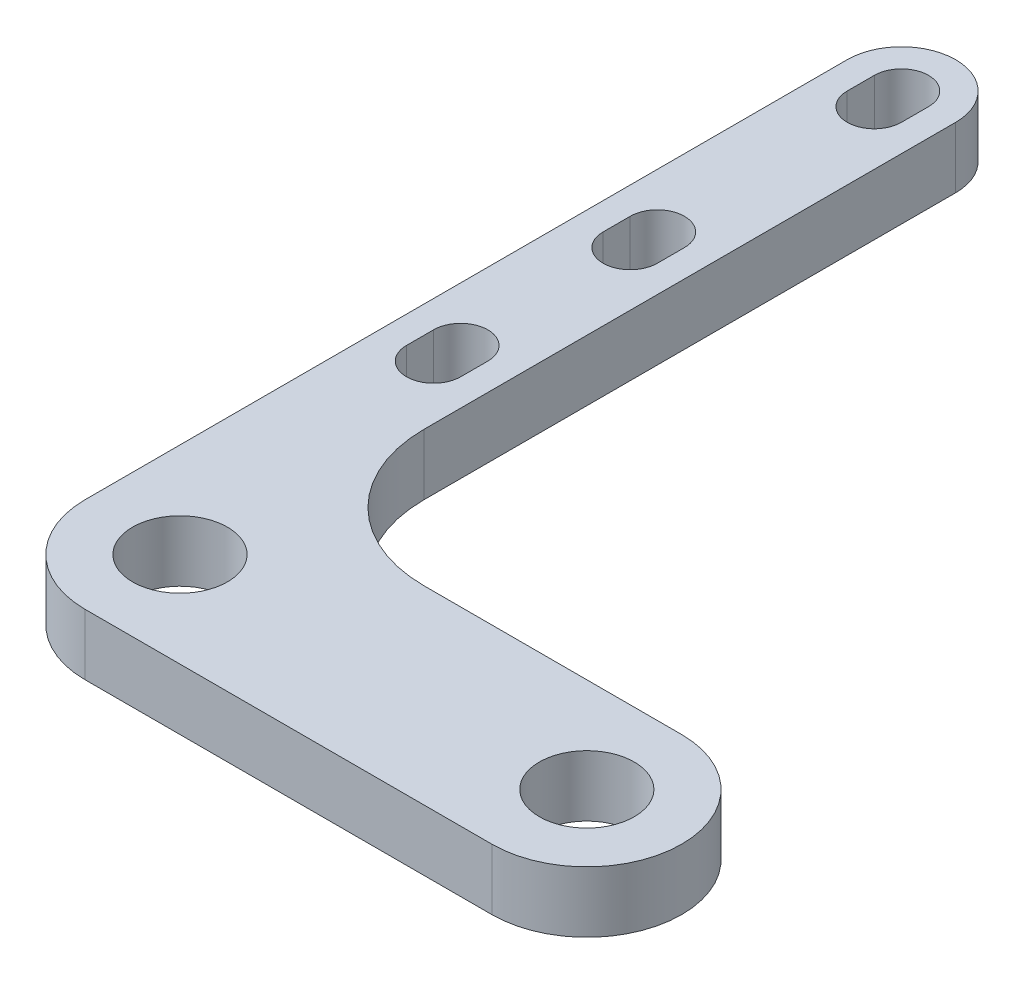
ISO-10303-21;
HEADER;
FILE_DESCRIPTION(('STEP AP214'),'2;1');
FILE_NAME('part.step','',(''),(''),'','','');
FILE_SCHEMA(('AUTOMOTIVE_DESIGN { 1 0 10303 214 1 1 1 1 }'));
ENDSEC;
DATA;
#1=APPLICATION_CONTEXT('core data for automotive mechanical design processes');
#2=APPLICATION_PROTOCOL_DEFINITION('international standard','automotive_design',2000,#1);
#3=PRODUCT_CONTEXT('',#1,'mechanical');
#4=PRODUCT('Part','Part','',(#3));
#5=PRODUCT_RELATED_PRODUCT_CATEGORY('part','',(#4));
#6=PRODUCT_DEFINITION_FORMATION('','',#4);
#7=PRODUCT_DEFINITION_CONTEXT('part definition',#1,'design');
#8=PRODUCT_DEFINITION('design','',#6,#7);
#9=PRODUCT_DEFINITION_SHAPE('','',#8);
#10=(LENGTH_UNIT() NAMED_UNIT(*) SI_UNIT(.MILLI.,.METRE.));
#11=(NAMED_UNIT(*) PLANE_ANGLE_UNIT() SI_UNIT($,.RADIAN.));
#12=(NAMED_UNIT(*) SI_UNIT($,.STERADIAN.) SOLID_ANGLE_UNIT());
#13=UNCERTAINTY_MEASURE_WITH_UNIT(LENGTH_MEASURE(1.E-05),#10,'distance_accuracy_value','');
#14=(GEOMETRIC_REPRESENTATION_CONTEXT(3) GLOBAL_UNCERTAINTY_ASSIGNED_CONTEXT((#13)) GLOBAL_UNIT_ASSIGNED_CONTEXT((#10,
#11,#12)) REPRESENTATION_CONTEXT('',''));
#15=CARTESIAN_POINT('',(0.,0.,0.));
#16=DIRECTION('',(0.,0.,1.));
#17=DIRECTION('',(1.,0.,0.));
#18=AXIS2_PLACEMENT_3D('',#15,#16,#17);
#19=CARTESIAN_POINT('',(30.,4.5,0.));
#20=DIRECTION('',(0.,1.,0.));
#21=DIRECTION('',(0.,0.,1.));
#22=AXIS2_PLACEMENT_3D('',#19,#20,#21);
#23=PLANE('',#22);
#24=CARTESIAN_POINT('',(0.,4.5,0.));
#25=DIRECTION('',(0.,1.,0.));
#26=DIRECTION('',(0.,0.,1.));
#27=AXIS2_PLACEMENT_3D('',#24,#25,#26);
#28=CIRCLE('',#27,3.5);
#29=CARTESIAN_POINT('',(0.,4.5,3.5));
#30=VERTEX_POINT('',#29);
#31=EDGE_CURVE('E327',#30,#30,#28,.T.);
#32=ORIENTED_EDGE('',*,*,#31,.F.);
#33=EDGE_LOOP('',(#32));
#34=FACE_BOUND('',#33,.T.);
#35=CARTESIAN_POINT('',(30.,4.5,0.));
#36=DIRECTION('',(0.,1.,0.));
#37=DIRECTION('',(0.,0.,1.));
#38=AXIS2_PLACEMENT_3D('',#35,#36,#37);
#39=CIRCLE('',#38,7.);
#40=CARTESIAN_POINT('',(30.,4.5,7.));
#41=VERTEX_POINT('',#40);
#42=CARTESIAN_POINT('',(30.,4.5,-7.));
#43=VERTEX_POINT('',#42);
#44=EDGE_CURVE('E335',#41,#43,#39,.T.);
#45=ORIENTED_EDGE('',*,*,#44,.T.);
#46=DIRECTION('',(-1.,0.,0.));
#47=VECTOR('',#46,1.);
#48=CARTESIAN_POINT('',(11.,4.5,-7.));
#49=LINE('',#48,#47);
#50=CARTESIAN_POINT('',(11.,4.5,-7.));
#51=VERTEX_POINT('',#50);
#52=EDGE_CURVE('E339',#43,#51,#49,.T.);
#53=ORIENTED_EDGE('',*,*,#52,.T.);
#54=CARTESIAN_POINT('',(11.,4.5,-17.));
#55=DIRECTION('',(0.,-1.,0.));
#56=DIRECTION('',(0.,0.,1.));
#57=AXIS2_PLACEMENT_3D('',#54,#55,#56);
#58=CIRCLE('',#57,10.);
#59=CARTESIAN_POINT('',(1.,4.5,-17.));
#60=VERTEX_POINT('',#59);
#61=EDGE_CURVE('E343',#51,#60,#58,.T.);
#62=ORIENTED_EDGE('',*,*,#61,.T.);
#63=DIRECTION('',(0.,0.,-1.));
#64=VECTOR('',#63,1.);
#65=CARTESIAN_POINT('',(0.999999999999997,4.5,-56.2));
#66=LINE('',#65,#64);
#67=CARTESIAN_POINT('',(0.999999999999997,4.5,-56.2));
#68=VERTEX_POINT('',#67);
#69=EDGE_CURVE('E346',#60,#68,#66,.T.);
#70=ORIENTED_EDGE('',*,*,#69,.T.);
#71=CARTESIAN_POINT('',(-3.,4.5,-56.2));
#72=DIRECTION('',(0.,1.,0.));
#73=DIRECTION('',(0.,0.,1.));
#74=AXIS2_PLACEMENT_3D('',#71,#72,#73);
#75=CIRCLE('',#74,4.);
#76=CARTESIAN_POINT('',(-7.,4.5,-56.2));
#77=VERTEX_POINT('',#76);
#78=EDGE_CURVE('E349',#68,#77,#75,.T.);
#79=ORIENTED_EDGE('',*,*,#78,.T.);
#80=DIRECTION('',(0.,0.,1.));
#81=VECTOR('',#80,1.);
#82=CARTESIAN_POINT('',(-7.,4.5,-56.2));
#83=LINE('',#82,#81);
#84=CARTESIAN_POINT('',(-7.,4.5,0.));
#85=VERTEX_POINT('',#84);
#86=EDGE_CURVE('E352',#77,#85,#83,.T.);
#87=ORIENTED_EDGE('',*,*,#86,.T.);
#88=CARTESIAN_POINT('',(0.,4.5,0.));
#89=DIRECTION('',(0.,1.,0.));
#90=DIRECTION('',(0.,0.,1.));
#91=AXIS2_PLACEMENT_3D('',#88,#89,#90);
#92=CIRCLE('',#91,7.);
#93=CARTESIAN_POINT('',(0.,4.5,7.));
#94=VERTEX_POINT('',#93);
#95=EDGE_CURVE('E355',#85,#94,#92,.T.);
#96=ORIENTED_EDGE('',*,*,#95,.T.);
#97=DIRECTION('',(1.,0.,0.));
#98=VECTOR('',#97,1.);
#99=CARTESIAN_POINT('',(0.,4.5,7.));
#100=LINE('',#99,#98);
#101=EDGE_CURVE('E358',#94,#41,#100,.T.);
#102=ORIENTED_EDGE('',*,*,#101,.T.);
#103=EDGE_LOOP('',(#45,#53,#62,#70,#79,#87,#96,#102));
#104=FACE_BOUND('',#103,.T.);
#105=CARTESIAN_POINT('',(30.,4.5,0.));
#106=DIRECTION('',(0.,1.,0.));
#107=DIRECTION('',(0.,0.,1.));
#108=AXIS2_PLACEMENT_3D('',#105,#106,#107);
#109=CIRCLE('',#108,3.5);
#110=CARTESIAN_POINT('',(30.,4.5,3.5));
#111=VERTEX_POINT('',#110);
#112=EDGE_CURVE('E319',#111,#111,#109,.T.);
#113=ORIENTED_EDGE('',*,*,#112,.F.);
#114=EDGE_LOOP('',(#113));
#115=FACE_BOUND('',#114,.T.);
#116=DIRECTION('',(0.,0.,-1.));
#117=VECTOR('',#116,1.);
#118=CARTESIAN_POINT('',(-1.00000000000001,4.5,-21.7));
#119=LINE('',#118,#117);
#120=CARTESIAN_POINT('',(-1.00000000000001,4.5,-21.7));
#121=VERTEX_POINT('',#120);
#122=CARTESIAN_POINT('',(-1.,4.5,-23.7));
#123=VERTEX_POINT('',#122);
#124=EDGE_CURVE('E279',#121,#123,#119,.T.);
#125=ORIENTED_EDGE('',*,*,#124,.F.);
#126=CARTESIAN_POINT('',(-3.,4.5,-21.7));
#127=DIRECTION('',(0.,1.,0.));
#128=DIRECTION('',(0.,0.,1.));
#129=AXIS2_PLACEMENT_3D('',#126,#127,#128);
#130=CIRCLE('',#129,2.);
#131=CARTESIAN_POINT('',(-5.,4.5,-21.7));
#132=VERTEX_POINT('',#131);
#133=EDGE_CURVE('E276',#132,#121,#130,.T.);
#134=ORIENTED_EDGE('',*,*,#133,.F.);
#135=DIRECTION('',(0.,0.,1.));
#136=VECTOR('',#135,1.);
#137=CARTESIAN_POINT('',(-5.,4.5,-21.7));
#138=LINE('',#137,#136);
#139=CARTESIAN_POINT('',(-5.,4.5,-23.7));
#140=VERTEX_POINT('',#139);
#141=EDGE_CURVE('E287',#140,#132,#138,.T.);
#142=ORIENTED_EDGE('',*,*,#141,.F.);
#143=CARTESIAN_POINT('',(-3.,4.5,-23.7));
#144=DIRECTION('',(0.,1.,0.));
#145=DIRECTION('',(0.,0.,1.));
#146=AXIS2_PLACEMENT_3D('',#143,#144,#145);
#147=CIRCLE('',#146,2.);
#148=EDGE_CURVE('E283',#123,#140,#147,.T.);
#149=ORIENTED_EDGE('',*,*,#148,.F.);
#150=EDGE_LOOP('',(#125,#134,#142,#149));
#151=FACE_BOUND('',#150,.T.);
#152=DIRECTION('',(0.,0.,-1.));
#153=VECTOR('',#152,1.);
#154=CARTESIAN_POINT('',(-0.999999999999999,4.5,-36.2));
#155=LINE('',#154,#153);
#156=CARTESIAN_POINT('',(-0.999999999999999,4.5,-36.2));
#157=VERTEX_POINT('',#156);
#158=CARTESIAN_POINT('',(-1.,4.5,-38.2));
#159=VERTEX_POINT('',#158);
#160=EDGE_CURVE('E236',#157,#159,#155,.T.);
#161=ORIENTED_EDGE('',*,*,#160,.F.);
#162=CARTESIAN_POINT('',(-3.,4.5,-36.2));
#163=DIRECTION('',(0.,1.,0.));
#164=DIRECTION('',(0.,0.,1.));
#165=AXIS2_PLACEMENT_3D('',#162,#163,#164);
#166=CIRCLE('',#165,2.);
#167=CARTESIAN_POINT('',(-5.,4.5,-36.2));
#168=VERTEX_POINT('',#167);
#169=EDGE_CURVE('E233',#168,#157,#166,.T.);
#170=ORIENTED_EDGE('',*,*,#169,.F.);
#171=DIRECTION('',(0.,0.,1.));
#172=VECTOR('',#171,1.);
#173=CARTESIAN_POINT('',(-5.,4.5,-36.2));
#174=LINE('',#173,#172);
#175=CARTESIAN_POINT('',(-5.,4.5,-38.2));
#176=VERTEX_POINT('',#175);
#177=EDGE_CURVE('E244',#176,#168,#174,.T.);
#178=ORIENTED_EDGE('',*,*,#177,.F.);
#179=CARTESIAN_POINT('',(-3.,4.5,-38.2));
#180=DIRECTION('',(0.,1.,0.));
#181=DIRECTION('',(0.,0.,1.));
#182=AXIS2_PLACEMENT_3D('',#179,#180,#181);
#183=CIRCLE('',#182,2.);
#184=EDGE_CURVE('E240',#159,#176,#183,.T.);
#185=ORIENTED_EDGE('',*,*,#184,.F.);
#186=EDGE_LOOP('',(#161,#170,#178,#185));
#187=FACE_BOUND('',#186,.T.);
#188=DIRECTION('',(0.,0.,-1.));
#189=VECTOR('',#188,1.);
#190=CARTESIAN_POINT('',(-1.,4.5,-54.2));
#191=LINE('',#190,#189);
#192=CARTESIAN_POINT('',(-1.,4.5,-54.2));
#193=VERTEX_POINT('',#192);
#194=CARTESIAN_POINT('',(-1.,4.5,-56.2));
#195=VERTEX_POINT('',#194);
#196=EDGE_CURVE('E194',#193,#195,#191,.T.);
#197=ORIENTED_EDGE('',*,*,#196,.F.);
#198=CARTESIAN_POINT('',(-3.,4.5,-54.2));
#199=DIRECTION('',(0.,1.,0.));
#200=DIRECTION('',(0.,0.,1.));
#201=AXIS2_PLACEMENT_3D('',#198,#199,#200);
#202=CIRCLE('',#201,2.);
#203=CARTESIAN_POINT('',(-5.,4.5,-54.2));
#204=VERTEX_POINT('',#203);
#205=EDGE_CURVE('E185',#204,#193,#202,.T.);
#206=ORIENTED_EDGE('',*,*,#205,.F.);
#207=DIRECTION('',(0.,0.,1.));
#208=VECTOR('',#207,1.);
#209=CARTESIAN_POINT('',(-5.,4.5,-54.2));
#210=LINE('',#209,#208);
#211=CARTESIAN_POINT('',(-5.,4.5,-56.2));
#212=VERTEX_POINT('',#211);
#213=EDGE_CURVE('E211',#212,#204,#210,.T.);
#214=ORIENTED_EDGE('',*,*,#213,.F.);
#215=CARTESIAN_POINT('',(-3.,4.5,-56.2));
#216=DIRECTION('',(0.,1.,0.));
#217=DIRECTION('',(0.,0.,1.));
#218=AXIS2_PLACEMENT_3D('',#215,#216,#217);
#219=CIRCLE('',#218,2.);
#220=EDGE_CURVE('E207',#195,#212,#219,.T.);
#221=ORIENTED_EDGE('',*,*,#220,.F.);
#222=EDGE_LOOP('',(#197,#206,#214,#221));
#223=FACE_BOUND('',#222,.T.);
#224=ADVANCED_FACE('F47',(#34,#104,#115,#151,#187,#223),#23,.T.);
#225=CARTESIAN_POINT('',(30.,0.,0.));
#226=DIRECTION('',(0.,1.,0.));
#227=DIRECTION('',(0.,0.,1.));
#228=AXIS2_PLACEMENT_3D('',#225,#226,#227);
#229=PLANE('',#228);
#230=CARTESIAN_POINT('',(-3.,0.,-36.2));
#231=DIRECTION('',(0.,1.,0.));
#232=DIRECTION('',(0.,0.,1.));
#233=AXIS2_PLACEMENT_3D('',#230,#231,#232);
#234=CIRCLE('',#233,2.);
#235=CARTESIAN_POINT('',(-5.,0.,-36.2));
#236=VERTEX_POINT('',#235);
#237=CARTESIAN_POINT('',(-0.999999999999999,0.,-36.2));
#238=VERTEX_POINT('',#237);
#239=EDGE_CURVE('E203',#236,#238,#234,.T.);
#240=ORIENTED_EDGE('',*,*,#239,.T.);
#241=DIRECTION('',(0.,0.,-1.));
#242=VECTOR('',#241,1.);
#243=CARTESIAN_POINT('',(-0.999999999999999,0.,-36.2));
#244=LINE('',#243,#242);
#245=CARTESIAN_POINT('',(-1.,0.,-38.2));
#246=VERTEX_POINT('',#245);
#247=EDGE_CURVE('E251',#238,#246,#244,.T.);
#248=ORIENTED_EDGE('',*,*,#247,.T.);
#249=CARTESIAN_POINT('',(-3.,0.,-38.2));
#250=DIRECTION('',(0.,1.,0.));
#251=DIRECTION('',(0.,0.,1.));
#252=AXIS2_PLACEMENT_3D('',#249,#250,#251);
#253=CIRCLE('',#252,2.);
#254=CARTESIAN_POINT('',(-5.,0.,-38.2));
#255=VERTEX_POINT('',#254);
#256=EDGE_CURVE('E255',#246,#255,#253,.T.);
#257=ORIENTED_EDGE('',*,*,#256,.T.);
#258=DIRECTION('',(0.,0.,1.));
#259=VECTOR('',#258,1.);
#260=CARTESIAN_POINT('',(-5.,0.,-36.2));
#261=LINE('',#260,#259);
#262=EDGE_CURVE('E237',#255,#236,#261,.T.);
#263=ORIENTED_EDGE('',*,*,#262,.T.);
#264=EDGE_LOOP('',(#240,#248,#257,#263));
#265=FACE_BOUND('',#264,.T.);
#266=CARTESIAN_POINT('',(30.,0.,0.));
#267=DIRECTION('',(0.,1.,0.));
#268=DIRECTION('',(0.,0.,1.));
#269=AXIS2_PLACEMENT_3D('',#266,#267,#268);
#270=CIRCLE('',#269,3.5);
#271=CARTESIAN_POINT('',(30.,0.,3.5));
#272=VERTEX_POINT('',#271);
#273=EDGE_CURVE('E318',#272,#272,#270,.T.);
#274=ORIENTED_EDGE('',*,*,#273,.T.);
#275=EDGE_LOOP('',(#274));
#276=FACE_BOUND('',#275,.T.);
#277=CARTESIAN_POINT('',(0.,0.,0.));
#278=DIRECTION('',(0.,1.,0.));
#279=DIRECTION('',(0.,0.,1.));
#280=AXIS2_PLACEMENT_3D('',#277,#278,#279);
#281=CIRCLE('',#280,3.5);
#282=CARTESIAN_POINT('',(0.,0.,3.5));
#283=VERTEX_POINT('',#282);
#284=EDGE_CURVE('E323',#283,#283,#281,.T.);
#285=ORIENTED_EDGE('',*,*,#284,.T.);
#286=EDGE_LOOP('',(#285));
#287=FACE_BOUND('',#286,.T.);
#288=CARTESIAN_POINT('',(30.,0.,0.));
#289=DIRECTION('',(0.,1.,0.));
#290=DIRECTION('',(0.,0.,1.));
#291=AXIS2_PLACEMENT_3D('',#288,#289,#290);
#292=CIRCLE('',#291,7.);
#293=CARTESIAN_POINT('',(30.,0.,7.));
#294=VERTEX_POINT('',#293);
#295=CARTESIAN_POINT('',(30.,0.,-7.));
#296=VERTEX_POINT('',#295);
#297=EDGE_CURVE('E331',#294,#296,#292,.T.);
#298=ORIENTED_EDGE('',*,*,#297,.F.);
#299=DIRECTION('',(1.,0.,0.));
#300=VECTOR('',#299,1.);
#301=CARTESIAN_POINT('',(0.,0.,7.));
#302=LINE('',#301,#300);
#303=CARTESIAN_POINT('',(0.,0.,7.));
#304=VERTEX_POINT('',#303);
#305=EDGE_CURVE('E340',#304,#294,#302,.T.);
#306=ORIENTED_EDGE('',*,*,#305,.F.);
#307=CARTESIAN_POINT('',(0.,0.,0.));
#308=DIRECTION('',(0.,1.,0.));
#309=DIRECTION('',(0.,0.,1.));
#310=AXIS2_PLACEMENT_3D('',#307,#308,#309);
#311=CIRCLE('',#310,7.);
#312=CARTESIAN_POINT('',(-7.,0.,0.));
#313=VERTEX_POINT('',#312);
#314=EDGE_CURVE('E381',#313,#304,#311,.T.);
#315=ORIENTED_EDGE('',*,*,#314,.F.);
#316=DIRECTION('',(0.,0.,1.));
#317=VECTOR('',#316,1.);
#318=CARTESIAN_POINT('',(-7.,0.,0.));
#319=LINE('',#318,#317);
#320=CARTESIAN_POINT('',(-7.,0.,-56.2));
#321=VERTEX_POINT('',#320);
#322=EDGE_CURVE('E378',#321,#313,#319,.T.);
#323=ORIENTED_EDGE('',*,*,#322,.F.);
#324=CARTESIAN_POINT('',(-3.,0.,-56.2));
#325=DIRECTION('',(0.,1.,0.));
#326=DIRECTION('',(0.,0.,1.));
#327=AXIS2_PLACEMENT_3D('',#324,#325,#326);
#328=CIRCLE('',#327,4.);
#329=CARTESIAN_POINT('',(0.999999999999997,0.,-56.2));
#330=VERTEX_POINT('',#329);
#331=EDGE_CURVE('E374',#330,#321,#328,.T.);
#332=ORIENTED_EDGE('',*,*,#331,.F.);
#333=DIRECTION('',(0.,0.,-1.));
#334=VECTOR('',#333,1.);
#335=CARTESIAN_POINT('',(0.999999999999997,0.,-56.2));
#336=LINE('',#335,#334);
#337=CARTESIAN_POINT('',(1.,0.,-17.));
#338=VERTEX_POINT('',#337);
#339=EDGE_CURVE('E371',#338,#330,#336,.T.);
#340=ORIENTED_EDGE('',*,*,#339,.F.);
#341=CARTESIAN_POINT('',(11.,0.,-17.));
#342=DIRECTION('',(0.,-1.,0.));
#343=DIRECTION('',(0.,0.,1.));
#344=AXIS2_PLACEMENT_3D('',#341,#342,#343);
#345=CIRCLE('',#344,10.);
#346=CARTESIAN_POINT('',(11.,0.,-7.));
#347=VERTEX_POINT('',#346);
#348=EDGE_CURVE('E368',#347,#338,#345,.T.);
#349=ORIENTED_EDGE('',*,*,#348,.F.);
#350=DIRECTION('',(-1.,0.,0.));
#351=VECTOR('',#350,1.);
#352=CARTESIAN_POINT('',(11.,0.,-7.));
#353=LINE('',#352,#351);
#354=EDGE_CURVE('E365',#296,#347,#353,.T.);
#355=ORIENTED_EDGE('',*,*,#354,.F.);
#356=EDGE_LOOP('',(#298,#306,#315,#323,#332,#340,#349,#355));
#357=FACE_BOUND('',#356,.T.);
#358=CARTESIAN_POINT('',(-3.,0.,-21.7));
#359=DIRECTION('',(0.,1.,0.));
#360=DIRECTION('',(0.,0.,1.));
#361=AXIS2_PLACEMENT_3D('',#358,#359,#360);
#362=CIRCLE('',#361,2.);
#363=CARTESIAN_POINT('',(-5.,0.,-21.7));
#364=VERTEX_POINT('',#363);
#365=CARTESIAN_POINT('',(-1.00000000000001,0.,-21.7));
#366=VERTEX_POINT('',#365);
#367=EDGE_CURVE('E275',#364,#366,#362,.T.);
#368=ORIENTED_EDGE('',*,*,#367,.T.);
#369=DIRECTION('',(0.,0.,-1.));
#370=VECTOR('',#369,1.);
#371=CARTESIAN_POINT('',(-1.00000000000001,0.,-21.7));
#372=LINE('',#371,#370);
#373=CARTESIAN_POINT('',(-1.,0.,-23.7));
#374=VERTEX_POINT('',#373);
#375=EDGE_CURVE('E294',#366,#374,#372,.T.);
#376=ORIENTED_EDGE('',*,*,#375,.T.);
#377=CARTESIAN_POINT('',(-3.,0.,-23.7));
#378=DIRECTION('',(0.,1.,0.));
#379=DIRECTION('',(0.,0.,1.));
#380=AXIS2_PLACEMENT_3D('',#377,#378,#379);
#381=CIRCLE('',#380,2.);
#382=CARTESIAN_POINT('',(-5.,0.,-23.7));
#383=VERTEX_POINT('',#382);
#384=EDGE_CURVE('E298',#374,#383,#381,.T.);
#385=ORIENTED_EDGE('',*,*,#384,.T.);
#386=DIRECTION('',(0.,0.,1.));
#387=VECTOR('',#386,1.);
#388=CARTESIAN_POINT('',(-5.,0.,-21.7));
#389=LINE('',#388,#387);
#390=EDGE_CURVE('E280',#383,#364,#389,.T.);
#391=ORIENTED_EDGE('',*,*,#390,.T.);
#392=EDGE_LOOP('',(#368,#376,#385,#391));
#393=FACE_BOUND('',#392,.T.);
#394=CARTESIAN_POINT('',(-3.,0.,-54.2));
#395=DIRECTION('',(0.,1.,0.));
#396=DIRECTION('',(0.,0.,1.));
#397=AXIS2_PLACEMENT_3D('',#394,#395,#396);
#398=CIRCLE('',#397,2.);
#399=CARTESIAN_POINT('',(-5.,0.,-54.2));
#400=VERTEX_POINT('',#399);
#401=CARTESIAN_POINT('',(-1.,0.,-54.2));
#402=VERTEX_POINT('',#401);
#403=EDGE_CURVE('E71',#400,#402,#398,.T.);
#404=ORIENTED_EDGE('',*,*,#403,.T.);
#405=DIRECTION('',(0.,0.,-1.));
#406=VECTOR('',#405,1.);
#407=CARTESIAN_POINT('',(-1.,0.,-54.2));
#408=LINE('',#407,#406);
#409=CARTESIAN_POINT('',(-1.,0.,-56.2));
#410=VERTEX_POINT('',#409);
#411=EDGE_CURVE('E201',#402,#410,#408,.T.);
#412=ORIENTED_EDGE('',*,*,#411,.T.);
#413=CARTESIAN_POINT('',(-3.,0.,-56.2));
#414=DIRECTION('',(0.,1.,0.));
#415=DIRECTION('',(0.,0.,1.));
#416=AXIS2_PLACEMENT_3D('',#413,#414,#415);
#417=CIRCLE('',#416,2.);
#418=CARTESIAN_POINT('',(-5.,0.,-56.2));
#419=VERTEX_POINT('',#418);
#420=EDGE_CURVE('E220',#410,#419,#417,.T.);
#421=ORIENTED_EDGE('',*,*,#420,.T.);
#422=DIRECTION('',(0.,0.,1.));
#423=VECTOR('',#422,1.);
#424=CARTESIAN_POINT('',(-5.,0.,-54.2));
#425=LINE('',#424,#423);
#426=EDGE_CURVE('E195',#419,#400,#425,.T.);
#427=ORIENTED_EDGE('',*,*,#426,.T.);
#428=EDGE_LOOP('',(#404,#412,#421,#427));
#429=FACE_BOUND('',#428,.T.);
#430=ADVANCED_FACE('F420',(#265,#276,#287,#357,#393,#429),#229,.F.);
#431=CARTESIAN_POINT('',(30.,4.5,0.));
#432=DIRECTION('',(0.,-1.,0.));
#433=DIRECTION('',(0.,0.,-1.));
#434=AXIS2_PLACEMENT_3D('',#431,#432,#433);
#435=CYLINDRICAL_SURFACE('',#434,7.);
#436=ORIENTED_EDGE('',*,*,#297,.T.);
#437=DIRECTION('',(0.,-1.,0.));
#438=VECTOR('',#437,1.);
#439=CARTESIAN_POINT('',(30.,4.5,-7.));
#440=LINE('',#439,#438);
#441=EDGE_CURVE('E11',#43,#296,#440,.T.);
#442=ORIENTED_EDGE('',*,*,#441,.F.);
#443=ORIENTED_EDGE('',*,*,#44,.F.);
#444=DIRECTION('',(0.,-1.,0.));
#445=VECTOR('',#444,1.);
#446=CARTESIAN_POINT('',(30.,4.5,7.));
#447=LINE('',#446,#445);
#448=EDGE_CURVE('E361',#41,#294,#447,.T.);
#449=ORIENTED_EDGE('',*,*,#448,.T.);
#450=EDGE_LOOP('',(#436,#442,#443,#449));
#451=FACE_BOUND('',#450,.T.);
#452=ADVANCED_FACE('F49',(#451),#435,.T.);
#453=CARTESIAN_POINT('',(11.,4.5,-7.));
#454=DIRECTION('',(0.,0.,1.));
#455=DIRECTION('',(1.,0.,0.));
#456=AXIS2_PLACEMENT_3D('',#453,#454,#455);
#457=PLANE('',#456);
#458=ORIENTED_EDGE('',*,*,#354,.T.);
#459=DIRECTION('',(0.,-1.,0.));
#460=VECTOR('',#459,1.);
#461=CARTESIAN_POINT('',(11.,4.5,-7.));
#462=LINE('',#461,#460);
#463=EDGE_CURVE('E56',#51,#347,#462,.T.);
#464=ORIENTED_EDGE('',*,*,#463,.F.);
#465=ORIENTED_EDGE('',*,*,#52,.F.);
#466=ORIENTED_EDGE('',*,*,#441,.T.);
#467=EDGE_LOOP('',(#458,#464,#465,#466));
#468=FACE_BOUND('',#467,.T.);
#469=ADVANCED_FACE('F437',(#468),#457,.F.);
#470=CARTESIAN_POINT('',(11.,4.5,-17.));
#471=DIRECTION('',(0.,-1.,0.));
#472=DIRECTION('',(0.,0.,-1.));
#473=AXIS2_PLACEMENT_3D('',#470,#471,#472);
#474=CYLINDRICAL_SURFACE('',#473,10.);
#475=ORIENTED_EDGE('',*,*,#348,.T.);
#476=DIRECTION('',(0.,-1.,0.));
#477=VECTOR('',#476,1.);
#478=CARTESIAN_POINT('',(1.,4.5,-17.));
#479=LINE('',#478,#477);
#480=EDGE_CURVE('E405',#60,#338,#479,.T.);
#481=ORIENTED_EDGE('',*,*,#480,.F.);
#482=ORIENTED_EDGE('',*,*,#61,.F.);
#483=ORIENTED_EDGE('',*,*,#463,.T.);
#484=EDGE_LOOP('',(#475,#481,#482,#483));
#485=FACE_BOUND('',#484,.T.);
#486=ADVANCED_FACE('F414',(#485),#474,.F.);
#487=CARTESIAN_POINT('',(0.999999999999997,4.5,-56.2));
#488=DIRECTION('',(-1.,0.,0.));
#489=DIRECTION('',(0.,0.,1.));
#490=AXIS2_PLACEMENT_3D('',#487,#488,#489);
#491=PLANE('',#490);
#492=ORIENTED_EDGE('',*,*,#339,.T.);
#493=DIRECTION('',(0.,-1.,0.));
#494=VECTOR('',#493,1.);
#495=CARTESIAN_POINT('',(0.999999999999997,4.5,-56.2));
#496=LINE('',#495,#494);
#497=EDGE_CURVE('E401',#68,#330,#496,.T.);
#498=ORIENTED_EDGE('',*,*,#497,.F.);
#499=ORIENTED_EDGE('',*,*,#69,.F.);
#500=ORIENTED_EDGE('',*,*,#480,.T.);
#501=EDGE_LOOP('',(#492,#498,#499,#500));
#502=FACE_BOUND('',#501,.T.);
#503=ADVANCED_FACE('F425',(#502),#491,.F.);
#504=CARTESIAN_POINT('',(-3.,4.5,-56.2));
#505=DIRECTION('',(0.,-1.,0.));
#506=DIRECTION('',(0.,0.,-1.));
#507=AXIS2_PLACEMENT_3D('',#504,#505,#506);
#508=CYLINDRICAL_SURFACE('',#507,4.);
#509=ORIENTED_EDGE('',*,*,#331,.T.);
#510=DIRECTION('',(0.,-1.,0.));
#511=VECTOR('',#510,1.);
#512=CARTESIAN_POINT('',(-7.,4.5,-56.2));
#513=LINE('',#512,#511);
#514=EDGE_CURVE('E397',#77,#321,#513,.T.);
#515=ORIENTED_EDGE('',*,*,#514,.F.);
#516=ORIENTED_EDGE('',*,*,#78,.F.);
#517=ORIENTED_EDGE('',*,*,#497,.T.);
#518=EDGE_LOOP('',(#509,#515,#516,#517));
#519=FACE_BOUND('',#518,.T.);
#520=ADVANCED_FACE('F429',(#519),#508,.T.);
#521=CARTESIAN_POINT('',(-7.,4.5,0.));
#522=DIRECTION('',(1.,0.,0.));
#523=DIRECTION('',(0.,0.,-1.));
#524=AXIS2_PLACEMENT_3D('',#521,#522,#523);
#525=PLANE('',#524);
#526=ORIENTED_EDGE('',*,*,#322,.T.);
#527=DIRECTION('',(0.,-1.,0.));
#528=VECTOR('',#527,1.);
#529=CARTESIAN_POINT('',(-7.,4.5,0.));
#530=LINE('',#529,#528);
#531=EDGE_CURVE('E393',#85,#313,#530,.T.);
#532=ORIENTED_EDGE('',*,*,#531,.F.);
#533=ORIENTED_EDGE('',*,*,#86,.F.);
#534=ORIENTED_EDGE('',*,*,#514,.T.);
#535=EDGE_LOOP('',(#526,#532,#533,#534));
#536=FACE_BOUND('',#535,.T.);
#537=ADVANCED_FACE('F450',(#536),#525,.F.);
#538=CARTESIAN_POINT('',(0.,4.5,0.));
#539=DIRECTION('',(0.,-1.,0.));
#540=DIRECTION('',(0.,0.,-1.));
#541=AXIS2_PLACEMENT_3D('',#538,#539,#540);
#542=CYLINDRICAL_SURFACE('',#541,7.);
#543=ORIENTED_EDGE('',*,*,#314,.T.);
#544=DIRECTION('',(0.,-1.,0.));
#545=VECTOR('',#544,1.);
#546=CARTESIAN_POINT('',(0.,4.5,7.));
#547=LINE('',#546,#545);
#548=EDGE_CURVE('E389',#94,#304,#547,.T.);
#549=ORIENTED_EDGE('',*,*,#548,.F.);
#550=ORIENTED_EDGE('',*,*,#95,.F.);
#551=ORIENTED_EDGE('',*,*,#531,.T.);
#552=EDGE_LOOP('',(#543,#549,#550,#551));
#553=FACE_BOUND('',#552,.T.);
#554=ADVANCED_FACE('F448',(#553),#542,.T.);
#555=CARTESIAN_POINT('',(0.,4.5,7.));
#556=DIRECTION('',(0.,0.,-1.));
#557=DIRECTION('',(-1.,0.,0.));
#558=AXIS2_PLACEMENT_3D('',#555,#556,#557);
#559=PLANE('',#558);
#560=ORIENTED_EDGE('',*,*,#305,.T.);
#561=ORIENTED_EDGE('',*,*,#448,.F.);
#562=ORIENTED_EDGE('',*,*,#101,.F.);
#563=ORIENTED_EDGE('',*,*,#548,.T.);
#564=EDGE_LOOP('',(#560,#561,#562,#563));
#565=FACE_BOUND('',#564,.T.);
#566=ADVANCED_FACE('F443',(#565),#559,.F.);
#567=CARTESIAN_POINT('',(0.,4.5,0.));
#568=DIRECTION('',(0.,-1.,0.));
#569=DIRECTION('',(0.,0.,-1.));
#570=AXIS2_PLACEMENT_3D('',#567,#568,#569);
#571=CYLINDRICAL_SURFACE('',#570,3.5);
#572=ORIENTED_EDGE('',*,*,#31,.T.);
#573=EDGE_LOOP('',(#572));
#574=FACE_BOUND('',#573,.T.);
#575=ORIENTED_EDGE('',*,*,#284,.F.);
#576=EDGE_LOOP('',(#575));
#577=FACE_BOUND('',#576,.T.);
#578=ADVANCED_FACE('F469',(#574,#577),#571,.F.);
#579=CARTESIAN_POINT('',(30.,4.5,0.));
#580=DIRECTION('',(0.,-1.,0.));
#581=DIRECTION('',(0.,0.,-1.));
#582=AXIS2_PLACEMENT_3D('',#579,#580,#581);
#583=CYLINDRICAL_SURFACE('',#582,3.5);
#584=ORIENTED_EDGE('',*,*,#112,.T.);
#585=EDGE_LOOP('',(#584));
#586=FACE_BOUND('',#585,.T.);
#587=ORIENTED_EDGE('',*,*,#273,.F.);
#588=EDGE_LOOP('',(#587));
#589=FACE_BOUND('',#588,.T.);
#590=ADVANCED_FACE('F476',(#586,#589),#583,.F.);
#591=CARTESIAN_POINT('',(-3.,4.5,-21.7));
#592=DIRECTION('',(0.,-1.,0.));
#593=DIRECTION('',(0.,0.,-1.));
#594=AXIS2_PLACEMENT_3D('',#591,#592,#593);
#595=CYLINDRICAL_SURFACE('',#594,2.);
#596=ORIENTED_EDGE('',*,*,#367,.F.);
#597=DIRECTION('',(0.,-1.,0.));
#598=VECTOR('',#597,1.);
#599=CARTESIAN_POINT('',(-5.,4.5,-21.7));
#600=LINE('',#599,#598);
#601=EDGE_CURVE('E290',#132,#364,#600,.T.);
#602=ORIENTED_EDGE('',*,*,#601,.F.);
#603=ORIENTED_EDGE('',*,*,#133,.T.);
#604=DIRECTION('',(0.,-1.,0.));
#605=VECTOR('',#604,1.);
#606=CARTESIAN_POINT('',(-1.00000000000001,4.5,-21.7));
#607=LINE('',#606,#605);
#608=EDGE_CURVE('E314',#121,#366,#607,.T.);
#609=ORIENTED_EDGE('',*,*,#608,.T.);
#610=EDGE_LOOP('',(#596,#602,#603,#609));
#611=FACE_BOUND('',#610,.T.);
#612=ADVANCED_FACE('F481',(#611),#595,.F.);
#613=CARTESIAN_POINT('',(-1.00000000000001,4.5,-21.7));
#614=DIRECTION('',(-1.,0.,0.));
#615=DIRECTION('',(0.,0.,1.));
#616=AXIS2_PLACEMENT_3D('',#613,#614,#615);
#617=PLANE('',#616);
#618=ORIENTED_EDGE('',*,*,#375,.F.);
#619=ORIENTED_EDGE('',*,*,#608,.F.);
#620=ORIENTED_EDGE('',*,*,#124,.T.);
#621=DIRECTION('',(0.,-1.,0.));
#622=VECTOR('',#621,1.);
#623=CARTESIAN_POINT('',(-1.,4.5,-23.7));
#624=LINE('',#623,#622);
#625=EDGE_CURVE('E311',#123,#374,#624,.T.);
#626=ORIENTED_EDGE('',*,*,#625,.T.);
#627=EDGE_LOOP('',(#618,#619,#620,#626));
#628=FACE_BOUND('',#627,.T.);
#629=ADVANCED_FACE('F489',(#628),#617,.T.);
#630=CARTESIAN_POINT('',(-3.,4.5,-23.7));
#631=DIRECTION('',(0.,-1.,0.));
#632=DIRECTION('',(0.,0.,-1.));
#633=AXIS2_PLACEMENT_3D('',#630,#631,#632);
#634=CYLINDRICAL_SURFACE('',#633,2.);
#635=ORIENTED_EDGE('',*,*,#384,.F.);
#636=ORIENTED_EDGE('',*,*,#625,.F.);
#637=ORIENTED_EDGE('',*,*,#148,.T.);
#638=DIRECTION('',(0.,-1.,0.));
#639=VECTOR('',#638,1.);
#640=CARTESIAN_POINT('',(-5.,4.5,-23.7));
#641=LINE('',#640,#639);
#642=EDGE_CURVE('E308',#140,#383,#641,.T.);
#643=ORIENTED_EDGE('',*,*,#642,.T.);
#644=EDGE_LOOP('',(#635,#636,#637,#643));
#645=FACE_BOUND('',#644,.T.);
#646=ADVANCED_FACE('F496',(#645),#634,.F.);
#647=CARTESIAN_POINT('',(-5.,4.5,-21.7));
#648=DIRECTION('',(1.,0.,0.));
#649=DIRECTION('',(0.,0.,-1.));
#650=AXIS2_PLACEMENT_3D('',#647,#648,#649);
#651=PLANE('',#650);
#652=ORIENTED_EDGE('',*,*,#390,.F.);
#653=ORIENTED_EDGE('',*,*,#642,.F.);
#654=ORIENTED_EDGE('',*,*,#141,.T.);
#655=ORIENTED_EDGE('',*,*,#601,.T.);
#656=EDGE_LOOP('',(#652,#653,#654,#655));
#657=FACE_BOUND('',#656,.T.);
#658=ADVANCED_FACE('F500',(#657),#651,.T.);
#659=CARTESIAN_POINT('',(-3.,4.5,-36.2));
#660=DIRECTION('',(0.,-1.,0.));
#661=DIRECTION('',(0.,0.,-1.));
#662=AXIS2_PLACEMENT_3D('',#659,#660,#661);
#663=CYLINDRICAL_SURFACE('',#662,2.);
#664=ORIENTED_EDGE('',*,*,#239,.F.);
#665=DIRECTION('',(0.,-1.,0.));
#666=VECTOR('',#665,1.);
#667=CARTESIAN_POINT('',(-5.,4.5,-36.2));
#668=LINE('',#667,#666);
#669=EDGE_CURVE('E247',#168,#236,#668,.T.);
#670=ORIENTED_EDGE('',*,*,#669,.F.);
#671=ORIENTED_EDGE('',*,*,#169,.T.);
#672=DIRECTION('',(0.,-1.,0.));
#673=VECTOR('',#672,1.);
#674=CARTESIAN_POINT('',(-0.999999999999999,4.5,-36.2));
#675=LINE('',#674,#673);
#676=EDGE_CURVE('E271',#157,#238,#675,.T.);
#677=ORIENTED_EDGE('',*,*,#676,.T.);
#678=EDGE_LOOP('',(#664,#670,#671,#677));
#679=FACE_BOUND('',#678,.T.);
#680=ADVANCED_FACE('F504',(#679),#663,.F.);
#681=CARTESIAN_POINT('',(-0.999999999999999,4.5,-36.2));
#682=DIRECTION('',(-1.,0.,0.));
#683=DIRECTION('',(0.,0.,1.));
#684=AXIS2_PLACEMENT_3D('',#681,#682,#683);
#685=PLANE('',#684);
#686=ORIENTED_EDGE('',*,*,#247,.F.);
#687=ORIENTED_EDGE('',*,*,#676,.F.);
#688=ORIENTED_EDGE('',*,*,#160,.T.);
#689=DIRECTION('',(0.,-1.,0.));
#690=VECTOR('',#689,1.);
#691=CARTESIAN_POINT('',(-1.,4.5,-38.2));
#692=LINE('',#691,#690);
#693=EDGE_CURVE('E268',#159,#246,#692,.T.);
#694=ORIENTED_EDGE('',*,*,#693,.T.);
#695=EDGE_LOOP('',(#686,#687,#688,#694));
#696=FACE_BOUND('',#695,.T.);
#697=ADVANCED_FACE('F508',(#696),#685,.T.);
#698=CARTESIAN_POINT('',(-3.,4.5,-38.2));
#699=DIRECTION('',(0.,-1.,0.));
#700=DIRECTION('',(0.,0.,-1.));
#701=AXIS2_PLACEMENT_3D('',#698,#699,#700);
#702=CYLINDRICAL_SURFACE('',#701,2.);
#703=ORIENTED_EDGE('',*,*,#256,.F.);
#704=ORIENTED_EDGE('',*,*,#693,.F.);
#705=ORIENTED_EDGE('',*,*,#184,.T.);
#706=DIRECTION('',(0.,-1.,0.));
#707=VECTOR('',#706,1.);
#708=CARTESIAN_POINT('',(-5.,4.5,-38.2));
#709=LINE('',#708,#707);
#710=EDGE_CURVE('E265',#176,#255,#709,.T.);
#711=ORIENTED_EDGE('',*,*,#710,.T.);
#712=EDGE_LOOP('',(#703,#704,#705,#711));
#713=FACE_BOUND('',#712,.T.);
#714=ADVANCED_FACE('F512',(#713),#702,.F.);
#715=CARTESIAN_POINT('',(-5.,4.5,-36.2));
#716=DIRECTION('',(1.,0.,0.));
#717=DIRECTION('',(0.,0.,-1.));
#718=AXIS2_PLACEMENT_3D('',#715,#716,#717);
#719=PLANE('',#718);
#720=ORIENTED_EDGE('',*,*,#262,.F.);
#721=ORIENTED_EDGE('',*,*,#710,.F.);
#722=ORIENTED_EDGE('',*,*,#177,.T.);
#723=ORIENTED_EDGE('',*,*,#669,.T.);
#724=EDGE_LOOP('',(#720,#721,#722,#723));
#725=FACE_BOUND('',#724,.T.);
#726=ADVANCED_FACE('F516',(#725),#719,.T.);
#727=CARTESIAN_POINT('',(-3.,4.5,-54.2));
#728=DIRECTION('',(0.,-1.,0.));
#729=DIRECTION('',(0.,0.,-1.));
#730=AXIS2_PLACEMENT_3D('',#727,#728,#729);
#731=CYLINDRICAL_SURFACE('',#730,2.);
#732=ORIENTED_EDGE('',*,*,#403,.F.);
#733=DIRECTION('',(0.,-1.,0.));
#734=VECTOR('',#733,1.);
#735=CARTESIAN_POINT('',(-5.,4.5,-54.2));
#736=LINE('',#735,#734);
#737=EDGE_CURVE('E189',#204,#400,#736,.T.);
#738=ORIENTED_EDGE('',*,*,#737,.F.);
#739=ORIENTED_EDGE('',*,*,#205,.T.);
#740=DIRECTION('',(0.,-1.,0.));
#741=VECTOR('',#740,1.);
#742=CARTESIAN_POINT('',(-1.,4.5,-54.2));
#743=LINE('',#742,#741);
#744=EDGE_CURVE('E188',#193,#402,#743,.T.);
#745=ORIENTED_EDGE('',*,*,#744,.T.);
#746=EDGE_LOOP('',(#732,#738,#739,#745));
#747=FACE_BOUND('',#746,.T.);
#748=ADVANCED_FACE('F187',(#747),#731,.F.);
#749=CARTESIAN_POINT('',(-1.,4.5,-54.2));
#750=DIRECTION('',(-1.,0.,0.));
#751=DIRECTION('',(0.,0.,1.));
#752=AXIS2_PLACEMENT_3D('',#749,#750,#751);
#753=PLANE('',#752);
#754=ORIENTED_EDGE('',*,*,#411,.F.);
#755=ORIENTED_EDGE('',*,*,#744,.F.);
#756=ORIENTED_EDGE('',*,*,#196,.T.);
#757=DIRECTION('',(0.,-1.,0.));
#758=VECTOR('',#757,1.);
#759=CARTESIAN_POINT('',(-1.,4.5,-56.2));
#760=LINE('',#759,#758);
#761=EDGE_CURVE('E204',#195,#410,#760,.T.);
#762=ORIENTED_EDGE('',*,*,#761,.T.);
#763=EDGE_LOOP('',(#754,#755,#756,#762));
#764=FACE_BOUND('',#763,.T.);
#765=ADVANCED_FACE('F198',(#764),#753,.T.);
#766=CARTESIAN_POINT('',(-3.,4.5,-56.2));
#767=DIRECTION('',(0.,-1.,0.));
#768=DIRECTION('',(0.,0.,-1.));
#769=AXIS2_PLACEMENT_3D('',#766,#767,#768);
#770=CYLINDRICAL_SURFACE('',#769,2.);
#771=ORIENTED_EDGE('',*,*,#420,.F.);
#772=ORIENTED_EDGE('',*,*,#761,.F.);
#773=ORIENTED_EDGE('',*,*,#220,.T.);
#774=DIRECTION('',(0.,-1.,0.));
#775=VECTOR('',#774,1.);
#776=CARTESIAN_POINT('',(-5.,4.5,-56.2));
#777=LINE('',#776,#775);
#778=EDGE_CURVE('E63',#212,#419,#777,.T.);
#779=ORIENTED_EDGE('',*,*,#778,.T.);
#780=EDGE_LOOP('',(#771,#772,#773,#779));
#781=FACE_BOUND('',#780,.T.);
#782=ADVANCED_FACE('F525',(#781),#770,.F.);
#783=CARTESIAN_POINT('',(-5.,4.5,-54.2));
#784=DIRECTION('',(1.,0.,0.));
#785=DIRECTION('',(0.,0.,-1.));
#786=AXIS2_PLACEMENT_3D('',#783,#784,#785);
#787=PLANE('',#786);
#788=ORIENTED_EDGE('',*,*,#426,.F.);
#789=ORIENTED_EDGE('',*,*,#778,.F.);
#790=ORIENTED_EDGE('',*,*,#213,.T.);
#791=ORIENTED_EDGE('',*,*,#737,.T.);
#792=EDGE_LOOP('',(#788,#789,#790,#791));
#793=FACE_BOUND('',#792,.T.);
#794=ADVANCED_FACE('F528',(#793),#787,.T.);
#795=CLOSED_SHELL('',(#224,#430,#452,#469,#486,#503,#520,#537,#554,#566,#578,#590,#612,#629,
#646,#658,#680,#697,#714,#726,#748,#765,#782,#794));
#796=MANIFOLD_SOLID_BREP('B2',#795);
#797=ADVANCED_BREP_SHAPE_REPRESENTATION('',(#18,#796),#14);
#798=SHAPE_DEFINITION_REPRESENTATION(#9,#797);
ENDSEC;
END-ISO-10303-21;
